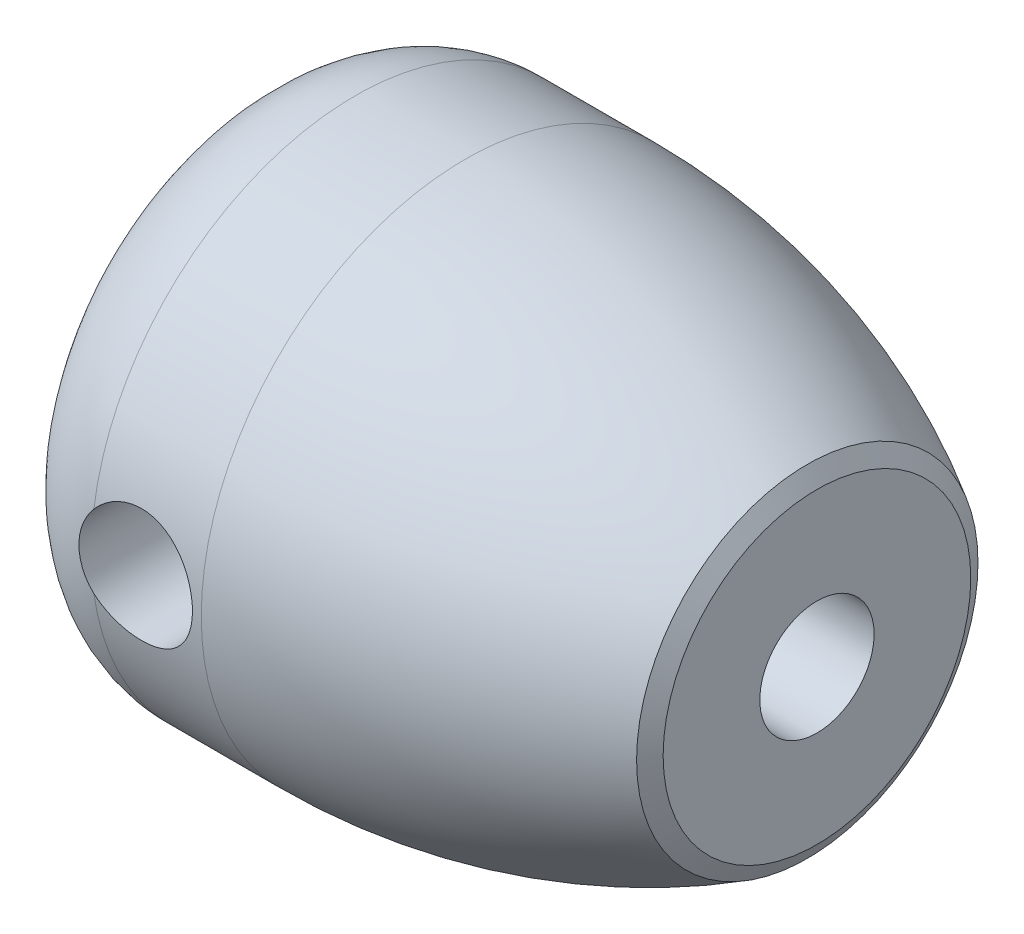
ISO-10303-21;
HEADER;
FILE_DESCRIPTION(('STEP AP214'),'2;1');
FILE_NAME('part.step','',(''),(''),'','','');
FILE_SCHEMA(('AUTOMOTIVE_DESIGN { 1 0 10303 214 1 1 1 1 }'));
ENDSEC;
DATA;
#1=APPLICATION_CONTEXT('core data for automotive mechanical design processes');
#2=APPLICATION_PROTOCOL_DEFINITION('international standard','automotive_design',2000,#1);
#3=PRODUCT_CONTEXT('',#1,'mechanical');
#4=PRODUCT('Part','Part','',(#3));
#5=PRODUCT_RELATED_PRODUCT_CATEGORY('part','',(#4));
#6=PRODUCT_DEFINITION_FORMATION('','',#4);
#7=PRODUCT_DEFINITION_CONTEXT('part definition',#1,'design');
#8=PRODUCT_DEFINITION('design','',#6,#7);
#9=PRODUCT_DEFINITION_SHAPE('','',#8);
#10=(LENGTH_UNIT() NAMED_UNIT(*) SI_UNIT(.MILLI.,.METRE.));
#11=(NAMED_UNIT(*) PLANE_ANGLE_UNIT() SI_UNIT($,.RADIAN.));
#12=(NAMED_UNIT(*) SI_UNIT($,.STERADIAN.) SOLID_ANGLE_UNIT());
#13=UNCERTAINTY_MEASURE_WITH_UNIT(LENGTH_MEASURE(1.E-05),#10,'distance_accuracy_value','');
#14=(GEOMETRIC_REPRESENTATION_CONTEXT(3) GLOBAL_UNCERTAINTY_ASSIGNED_CONTEXT((#13)) GLOBAL_UNIT_ASSIGNED_CONTEXT((#10,
#11,#12)) REPRESENTATION_CONTEXT('',''));
#15=CARTESIAN_POINT('',(0.,0.,0.));
#16=DIRECTION('',(0.,0.,1.));
#17=DIRECTION('',(1.,0.,0.));
#18=AXIS2_PLACEMENT_3D('',#15,#16,#17);
#19=CARTESIAN_POINT('',(150.000000000091,0.,25.7));
#20=DIRECTION('',(-1.,0.,0.));
#21=DIRECTION('',(0.,0.,1.));
#22=AXIS2_PLACEMENT_3D('',#19,#20,#21);
#23=CONICAL_SURFACE('',#22,3.59999999986421,0.785398163397448);
#24=CARTESIAN_POINT('',(149.999999999977,0.,25.7));
#25=DIRECTION('',(-1.,0.,0.));
#26=DIRECTION('',(0.,0.,1.));
#27=AXIS2_PLACEMENT_3D('',#24,#25,#26);
#28=CIRCLE('',#27,3.5999999999779);
#29=CARTESIAN_POINT('',(149.999999999977,0.,22.1000000000221));
#30=VERTEX_POINT('',#29);
#31=EDGE_CURVE('E28',#30,#30,#28,.T.);
#32=ORIENTED_EDGE('',*,*,#31,.T.);
#33=EDGE_LOOP('',(#32));
#34=FACE_BOUND('',#33,.T.);
#35=CARTESIAN_POINT('',(151.,0.,25.7));
#36=DIRECTION('',(-1.,0.,0.));
#37=DIRECTION('',(0.,0.,1.));
#38=AXIS2_PLACEMENT_3D('',#35,#36,#37);
#39=CIRCLE('',#38,2.6);
#40=CARTESIAN_POINT('',(151.000000000005,0.,23.1000000000277));
#41=VERTEX_POINT('',#40);
#42=EDGE_CURVE('E44',#41,#41,#39,.F.);
#43=ORIENTED_EDGE('',*,*,#42,.T.);
#44=EDGE_LOOP('',(#43));
#45=FACE_BOUND('',#44,.T.);
#46=ADVANCED_FACE('F24',(#34,#45),#23,.F.);
#47=CARTESIAN_POINT('',(150.,2.,25.7));
#48=DIRECTION('',(1.,0.,0.));
#49=DIRECTION('',(0.,0.,-1.));
#50=AXIS2_PLACEMENT_3D('',#47,#48,#49);
#51=PLANE('',#50);
#52=CARTESIAN_POINT('',(150.,0.,25.7));
#53=DIRECTION('',(1.,0.,0.));
#54=DIRECTION('',(0.,0.,-1.));
#55=AXIS2_PLACEMENT_3D('',#52,#53,#54);
#56=CIRCLE('',#55,4.);
#57=CARTESIAN_POINT('',(150.,0.,29.7));
#58=VERTEX_POINT('',#57);
#59=EDGE_CURVE('E76',#58,#58,#56,.F.);
#60=ORIENTED_EDGE('',*,*,#59,.T.);
#61=EDGE_LOOP('',(#60));
#62=FACE_BOUND('',#61,.T.);
#63=ORIENTED_EDGE('',*,*,#31,.F.);
#64=EDGE_LOOP('',(#63));
#65=FACE_BOUND('',#64,.T.);
#66=ADVANCED_FACE('F181',(#62,#65),#51,.F.);
#67=CARTESIAN_POINT('',(141.,0.,25.7));
#68=DIRECTION('',(-1.,0.,0.));
#69=DIRECTION('',(0.,0.,1.));
#70=AXIS2_PLACEMENT_3D('',#67,#68,#69);
#71=CYLINDRICAL_SURFACE('',#70,2.6);
#72=CARTESIAN_POINT('',(166.,0.,25.7));
#73=DIRECTION('',(-1.,0.,0.));
#74=DIRECTION('',(0.,0.,1.));
#75=AXIS2_PLACEMENT_3D('',#72,#73,#74);
#76=CIRCLE('',#75,2.6);
#77=CARTESIAN_POINT('',(166.,0.,23.1));
#78=VERTEX_POINT('',#77);
#79=EDGE_CURVE('E75',#78,#78,#76,.T.);
#80=ORIENTED_EDGE('',*,*,#79,.F.);
#81=EDGE_LOOP('',(#80));
#82=FACE_BOUND('',#81,.T.);
#83=ORIENTED_EDGE('',*,*,#42,.F.);
#84=EDGE_LOOP('',(#83));
#85=FACE_BOUND('',#84,.T.);
#86=ADVANCED_FACE('F176',(#82,#85),#71,.F.);
#87=CARTESIAN_POINT('',(158.,0.,25.7));
#88=DIRECTION('',(1.,0.,0.));
#89=DIRECTION('',(0.,0.,-1.));
#90=AXIS2_PLACEMENT_3D('',#87,#88,#89);
#91=CYLINDRICAL_SURFACE('',#90,4.);
#92=CARTESIAN_POINT('',(149.59662296296,0.132475464458119,29.6978057873731));
#93=CARTESIAN_POINT('',(149.58981293636,0.265790039976544,29.6933801911664));
#94=CARTESIAN_POINT('',(149.572677591586,0.398563930924519,29.6822397836795));
#95=CARTESIAN_POINT('',(149.518737574945,0.658551022762243,29.6476094242159));
#96=CARTESIAN_POINT('',(149.481881553717,0.785748764527289,29.624087234746));
#97=CARTESIAN_POINT('',(149.390676512943,1.03034002410986,29.5670501693243));
#98=CARTESIAN_POINT('',(149.336433446386,1.14778763495607,29.5335959061961));
#99=CARTESIAN_POINT('',(149.212523277691,1.37153622468492,29.4593618361864));
#100=CARTESIAN_POINT('',(149.142861440015,1.47784098988018,29.4185845305202));
#101=CARTESIAN_POINT('',(148.982559508075,1.68776328604901,29.3284596396862));
#102=CARTESIAN_POINT('',(148.890545471477,1.79013693831058,29.278664915614));
#103=CARTESIAN_POINT('',(148.691811911872,1.97904276960375,29.1777707577542));
#104=CARTESIAN_POINT('',(148.585066371127,2.06554627594957,29.1266691488874));
#105=CARTESIAN_POINT('',(148.343472919102,2.2314271905501,29.0213790086508));
#106=CARTESIAN_POINT('',(148.206775919937,2.30843234831411,28.9676472730087));
#107=CARTESIAN_POINT('',(147.918248891142,2.43754178054874,28.8725180370249));
#108=CARTESIAN_POINT('',(147.766463564659,2.48971710965312,28.8310854701805));
#109=CARTESIAN_POINT('',(147.499915707366,2.55396335102825,28.7787057802729));
#110=CARTESIAN_POINT('',(147.388001091221,2.57341547561538,28.7623129893019));
#111=CARTESIAN_POINT('',(147.161529954878,2.59746604719984,28.7419465256005));
#112=CARTESIAN_POINT('',(147.046976962762,2.60208328831588,28.737957139367));
#113=CARTESIAN_POINT('',(146.818534308042,2.5961772656909,28.7430039038321));
#114=CARTESIAN_POINT('',(146.70464486658,2.58564921520467,28.7520441726199));
#115=CARTESIAN_POINT('',(146.48065371036,2.55013326471023,28.7817750508417));
#116=CARTESIAN_POINT('',(146.370557333014,2.52512580524618,28.8024814183606));
#117=CARTESIAN_POINT('',(146.128320678821,2.45357824827613,28.8595158953777));
#118=CARTESIAN_POINT('',(145.997981907154,2.4031086040407,28.8985181398427));
#119=CARTESIAN_POINT('',(145.74920277249,2.28355580657512,28.9849359294465));
#120=CARTESIAN_POINT('',(145.630778485635,2.21444795541399,29.0323626093316));
#121=CARTESIAN_POINT('',(145.405264602871,2.05813480704452,29.1311452419162));
#122=CARTESIAN_POINT('',(145.298384220029,1.97066022986807,29.1825515279603));
#123=CARTESIAN_POINT('',(145.099423183974,1.7795675647161,29.2839745988868));
#124=CARTESIAN_POINT('',(145.007345401601,1.67594635289231,29.3339911126824));
#125=CARTESIAN_POINT('',(144.829443013665,1.43981105683484,29.4343368205253));
#126=CARTESIAN_POINT('',(144.745784363972,1.30531039278171,29.4839462100188));
#127=CARTESIAN_POINT('',(144.638905447606,1.09160517561115,29.5488940588772));
#128=CARTESIAN_POINT('',(144.606374329514,1.01835615629513,29.5689698126548));
#129=CARTESIAN_POINT('',(144.54798190071,0.868370235617365,29.6053638276849));
#130=CARTESIAN_POINT('',(144.522115637272,0.791635974347503,29.6216848781264));
#131=CARTESIAN_POINT('',(144.480258737996,0.644970064155253,29.6482742641426));
#132=CARTESIAN_POINT('',(144.463444860924,0.575362159020335,29.6590400869034));
#133=CARTESIAN_POINT('',(144.435573398483,0.43458105014889,29.6769547920284));
#134=CARTESIAN_POINT('',(144.424512405503,0.363408799123864,29.6841058154784));
#135=CARTESIAN_POINT('',(144.408335526373,0.220148835378806,29.694582077932));
#136=CARTESIAN_POINT('',(144.403216134084,0.148061687956418,29.6979095731875));
#137=CARTESIAN_POINT('',(144.398997800455,0.00366179681831511,29.7006515462698));
#138=CARTESIAN_POINT('',(144.399898225894,-0.0686509223698688,29.7000664356606));
#139=CARTESIAN_POINT('',(144.410575339027,-0.265317407721266,29.6931284062543));
#140=CARTESIAN_POINT('',(144.426330268683,-0.389277923129446,29.6828908238801));
#141=CARTESIAN_POINT('',(144.474998982236,-0.632268258703111,29.6516188276201));
#142=CARTESIAN_POINT('',(144.507914670691,-0.751297529999426,29.6305832153366));
#143=CARTESIAN_POINT('',(144.590006336953,-0.983529573800794,29.5790504633626));
#144=CARTESIAN_POINT('',(144.639423979838,-1.09661497215921,29.5484131466757));
#145=CARTESIAN_POINT('',(144.75256663132,-1.31300107241792,29.4800696992444));
#146=CARTESIAN_POINT('',(144.816294896217,-1.41629953973942,29.4423619599886));
#147=CARTESIAN_POINT('',(144.966006857939,-1.62529431405923,29.3568888643979));
#148=CARTESIAN_POINT('',(145.053841867989,-1.72938872680834,29.3084532658949));
#149=CARTESIAN_POINT('',(145.244140859815,-1.9223325400214,29.2094770425533));
#150=CARTESIAN_POINT('',(145.346629264275,-2.01115593287969,29.1589330052504));
#151=CARTESIAN_POINT('',(145.579865778936,-2.18335461998819,29.0532796458776));
#152=CARTESIAN_POINT('',(145.712561871274,-2.2643151433813,28.9984939320642));
#153=CARTESIAN_POINT('',(145.993374271695,-2.40229728636163,28.8994079028301));
#154=CARTESIAN_POINT('',(146.141453870311,-2.45937433216329,28.855083415608));
#155=CARTESIAN_POINT('',(146.404440992849,-2.53339861257035,28.7957144383401));
#156=CARTESIAN_POINT('',(146.516334378456,-2.557206489805,28.7758948307654));
#157=CARTESIAN_POINT('',(146.74367932852,-2.58987233258082,28.7484483611421));
#158=CARTESIAN_POINT('',(146.859125330018,-2.59875256978836,28.7408033358195));
#159=CARTESIAN_POINT('',(147.090494404359,-2.60100337356224,28.738879068557));
#160=CARTESIAN_POINT('',(147.206417962603,-2.59434580804404,28.7446240700045));
#161=CARTESIAN_POINT('',(147.435132209933,-2.56592680671194,28.7686063762949));
#162=CARTESIAN_POINT('',(147.547918735914,-2.5441462112302,28.7868595275781));
#163=CARTESIAN_POINT('',(147.791119176474,-2.48054943618112,28.838290183277));
#164=CARTESIAN_POINT('',(147.92016511967,-2.43545186522669,28.8738197605727));
#165=CARTESIAN_POINT('',(148.16730887644,-2.32715797297412,28.9540529419244));
#166=CARTESIAN_POINT('',(148.285392445963,-2.26393852884479,28.9987682458365));
#167=CARTESIAN_POINT('',(148.511108168794,-2.12007653610016,29.0930486564981));
#168=CARTESIAN_POINT('',(148.618550727395,-2.03917996414209,29.1426780026842));
#169=CARTESIAN_POINT('',(148.819797851726,-1.8618146609321,29.2417504602976));
#170=CARTESIAN_POINT('',(148.913598008454,-1.76534091655544,29.2911935065092));
#171=CARTESIAN_POINT('',(149.099593041642,-1.54142837973626,29.3934186052471));
#172=CARTESIAN_POINT('',(149.189246586867,-1.41150660233766,29.4455150903888));
#173=CARTESIAN_POINT('',(149.305814566445,-1.20396457637036,29.5152102507605));
#174=CARTESIAN_POINT('',(149.34168997321,-1.13266015114456,29.5370368506149));
#175=CARTESIAN_POINT('',(149.407015832335,-0.986253055113381,29.5772490417905));
#176=CARTESIAN_POINT('',(149.436468799538,-0.911151885245865,29.5956359795825));
#177=CARTESIAN_POINT('',(149.502072319254,-0.717526950876205,29.6369286471038));
#178=CARTESIAN_POINT('',(149.533668151805,-0.596837435636188,29.6571675409292));
#179=CARTESIAN_POINT('',(149.579202000132,-0.351086131691645,29.6864740183355));
#180=CARTESIAN_POINT('',(149.593187365202,-0.226037000238632,29.6955715558834));
#181=CARTESIAN_POINT('',(149.599557788611,-0.0618079768832174,29.6997129935192));
#182=CARTESIAN_POINT('',(149.600189162194,-0.0229344333446308,29.7001229150335));
#183=CARTESIAN_POINT('',(149.599713201889,0.0547998404490963,29.6998136219678));
#184=CARTESIAN_POINT('',(149.598605720413,0.0936605693365428,29.6990943115419));
#185=CARTESIAN_POINT('',(149.59662296296,0.132475464458119,29.6978057873731));
#186=B_SPLINE_CURVE_WITH_KNOTS('',3,(#92,#93,#94,#95,#96,#97,#98,#99,#100,#101,#102,#103,#104,
#105,#106,#107,#108,#109,#110,#111,#112,#113,#114,#115,#116,#117,#118,#119,#120,#121,#122,#123,
#124,#125,#126,#127,#128,#129,#130,#131,#132,#133,#134,#135,#136,#137,#138,#139,#140,#141,#142,
#143,#144,#145,#146,#147,#148,#149,#150,#151,#152,#153,#154,#155,#156,#157,#158,#159,#160,#161,
#162,#163,#164,#165,#166,#167,#168,#169,#170,#171,#172,#173,#174,#175,#176,#177,#178,#179,#180,
#181,#182,#183,#184,#185),.UNSPECIFIED.,.T.,.F.,(4,2,2,2,2,2,2,2,2,2,2,2,2,2,2,2,2,2,2,2,2,2,2,
2,2,2,2,2,2,2,2,2,2,2,2,2,2,2,2,2,2,2,2,2,2,2,4),(0.,0.400518308616243,0.802084611771821,
1.20124894669222,1.60027720379704,2.03771914208581,2.47594378926509,2.97089975899597,
3.46443068453901,3.80725688410091,4.14964859005098,4.49214853439135,4.8351122265237,
5.2681201939958,5.70170479408167,6.14215617417302,6.58269287331238,7.07747302731858,
7.32499795374042,7.57233840770576,7.78926515585522,8.00606326487925,8.22273337621442,
8.43938069654597,8.81356212024898,9.18778508070731,9.56774807694332,9.94779761934844,
10.3797904016547,10.8125117624612,11.3045341810873,11.7954083478197,12.1422636341049,
12.4886009601443,12.8355658361477,13.1829710928534,13.6044375030357,14.0264441007896,
14.4549687095857,14.883631504235,15.3792792837832,15.6271916819363,15.8750068296884,
16.2524428294711,16.6288618343455,16.7454639134283,16.8620758898964),.UNSPECIFIED.);
#187=CARTESIAN_POINT('',(149.596622856313,0.132475439500193,29.6978056803613));
#188=VERTEX_POINT('',#187);
#189=EDGE_CURVE('E79',#188,#188,#186,.T.);
#190=ORIENTED_EDGE('',*,*,#189,.T.);
#191=EDGE_LOOP('',(#190));
#192=FACE_BOUND('',#191,.T.);
#193=CARTESIAN_POINT('',(140.,0.,25.7));
#194=DIRECTION('',(1.,0.,0.));
#195=DIRECTION('',(0.,0.,-1.));
#196=AXIS2_PLACEMENT_3D('',#193,#194,#195);
#197=CIRCLE('',#196,4.);
#198=CARTESIAN_POINT('',(140.,0.,29.7));
#199=VERTEX_POINT('',#198);
#200=EDGE_CURVE('E71',#199,#199,#197,.F.);
#201=ORIENTED_EDGE('',*,*,#200,.T.);
#202=EDGE_LOOP('',(#201));
#203=FACE_BOUND('',#202,.T.);
#204=ORIENTED_EDGE('',*,*,#59,.F.);
#205=EDGE_LOOP('',(#204));
#206=FACE_BOUND('',#205,.T.);
#207=ADVANCED_FACE('F72',(#192,#203,#206),#91,.F.);
#208=CARTESIAN_POINT('',(140.,8.,25.7));
#209=DIRECTION('',(1.,0.,0.));
#210=DIRECTION('',(0.,0.,-1.));
#211=AXIS2_PLACEMENT_3D('',#208,#209,#210);
#212=PLANE('',#211);
#213=ORIENTED_EDGE('',*,*,#200,.F.);
#214=EDGE_LOOP('',(#213));
#215=FACE_BOUND('',#214,.T.);
#216=CARTESIAN_POINT('',(140.,0.,25.7));
#217=DIRECTION('',(1.,0.,0.));
#218=DIRECTION('',(0.,0.,-1.));
#219=AXIS2_PLACEMENT_3D('',#216,#217,#218);
#220=CIRCLE('',#219,7.);
#221=CARTESIAN_POINT('',(140.,0.,18.7));
#222=VERTEX_POINT('',#221);
#223=EDGE_CURVE('E157',#222,#222,#220,.T.);
#224=ORIENTED_EDGE('',*,*,#223,.F.);
#225=EDGE_LOOP('',(#224));
#226=FACE_BOUND('',#225,.T.);
#227=ADVANCED_FACE('F162',(#215,#226),#212,.F.);
#228=CARTESIAN_POINT('',(166.,3.75,25.7));
#229=DIRECTION('',(1.,0.,0.));
#230=DIRECTION('',(0.,0.,-1.));
#231=AXIS2_PLACEMENT_3D('',#228,#229,#230);
#232=PLANE('',#231);
#233=ORIENTED_EDGE('',*,*,#79,.T.);
#234=EDGE_LOOP('',(#233));
#235=FACE_BOUND('',#234,.T.);
#236=CARTESIAN_POINT('',(166.000000016742,0.,25.7));
#237=DIRECTION('',(-1.,0.,0.));
#238=DIRECTION('',(0.,-1.,0.));
#239=AXIS2_PLACEMENT_3D('',#236,#237,#238);
#240=CIRCLE('',#239,6.9951346840793);
#241=CARTESIAN_POINT('',(166.000000016742,0.,18.7048653159207));
#242=VERTEX_POINT('',#241);
#243=EDGE_CURVE('E120',#242,#242,#240,.T.);
#244=ORIENTED_EDGE('',*,*,#243,.F.);
#245=EDGE_LOOP('',(#244));
#246=FACE_BOUND('',#245,.T.);
#247=ADVANCED_FACE('F103',(#235,#246),#232,.T.);
#248=CARTESIAN_POINT('',(147.,0.,50.7));
#249=DIRECTION('',(0.,0.,1.));
#250=DIRECTION('',(1.,0.,0.));
#251=AXIS2_PLACEMENT_3D('',#248,#249,#250);
#252=CYLINDRICAL_SURFACE('',#251,2.6);
#253=ORIENTED_EDGE('',*,*,#189,.F.);
#254=EDGE_LOOP('',(#253));
#255=FACE_BOUND('',#254,.T.);
#256=CARTESIAN_POINT('',(145.,-1.66132477258355,37.5844436133965));
#257=CARTESIAN_POINT('',(144.954030730864,-1.60599821193209,37.5921781853039));
#258=CARTESIAN_POINT('',(144.910322555604,-1.54869417491541,37.5991541323627));
#259=CARTESIAN_POINT('',(144.827751064601,-1.43056471546217,37.6117540189274));
#260=CARTESIAN_POINT('',(144.788887209623,-1.36973968606447,37.6173781089778));
#261=CARTESIAN_POINT('',(144.716350733501,-1.24504788758821,37.6274364464122));
#262=CARTESIAN_POINT('',(144.682673269873,-1.18118402968037,37.6318718066029));
#263=CARTESIAN_POINT('',(144.620727415788,-1.05084528925676,37.6397141802864));
#264=CARTESIAN_POINT('',(144.592459040563,-0.98437039938931,37.6431211908838));
#265=CARTESIAN_POINT('',(144.516098988535,-0.781686126795168,37.6520199938556));
#266=CARTESIAN_POINT('',(144.476406296412,-0.642137810601589,37.6561954947261));
#267=CARTESIAN_POINT('',(144.420767420626,-0.358443976842378,37.6618873127111));
#268=CARTESIAN_POINT('',(144.404816349319,-0.214299411741231,37.6634041771656));
#269=CARTESIAN_POINT('',(144.397039780855,0.0753724908856252,37.6641556180581));
#270=CARTESIAN_POINT('',(144.405332830606,0.220903143147724,37.6633789797265));
#271=CARTESIAN_POINT('',(144.446092490359,0.508602704192278,37.6593205410185));
#272=CARTESIAN_POINT('',(144.478574958229,0.650769344517419,37.6560370972189));
#273=CARTESIAN_POINT('',(144.566822508326,0.927810347237031,37.6462248896265));
#274=CARTESIAN_POINT('',(144.622626394383,1.0626721308642,37.6396907135681));
#275=CARTESIAN_POINT('',(144.755750482228,1.32072881094094,37.6222346106281));
#276=CARTESIAN_POINT('',(144.833020337815,1.44395011357994,37.6113229244662));
#277=CARTESIAN_POINT('',(144.945625743606,1.59419059331891,37.5934565329378));
#278=CARTESIAN_POINT('',(144.972410703206,1.6281239929422,37.5890859071634));
#279=CARTESIAN_POINT('',(145.,1.66132477258359,37.5844436133965));
#280=B_SPLINE_CURVE_WITH_KNOTS('',3,(#256,#257,#258,#259,#260,#261,#262,#263,#264,#265,#266,
#267,#268,#269,#270,#271,#272,#273,#274,#275,#276,#277,#278,#279),.UNSPECIFIED.,.F.,.F.,(4,2,2,
2,2,2,2,2,2,2,2,4),(0.,0.216965041410872,0.433905910129942,0.650642978818805,0.867380657800993,
1.30058366624938,1.73369747963182,2.16893263405376,2.60445336723912,3.04070165412698,
3.47593528087374,3.60622716281149),.UNSPECIFIED.);
#281=CARTESIAN_POINT('',(145.,-1.66132477258357,37.5844436133965));
#282=VERTEX_POINT('',#281);
#283=CARTESIAN_POINT('',(145.,1.66132477258359,37.5844436133965));
#284=VERTEX_POINT('',#283);
#285=EDGE_CURVE('E88',#282,#284,#280,.T.);
#286=ORIENTED_EDGE('',*,*,#285,.F.);
#287=CARTESIAN_POINT('',(145.,1.66132477258359,37.5844436133965));
#288=CARTESIAN_POINT('',(145.046758920054,1.71761333184702,37.576575712641));
#289=CARTESIAN_POINT('',(145.095861372958,1.77189066138255,37.568579820057));
#290=CARTESIAN_POINT('',(145.198459432226,1.87611450652157,37.5525512301044));
#291=CARTESIAN_POINT('',(145.251955021089,1.92606103937577,37.5445185328826));
#292=CARTESIAN_POINT('',(145.418511737267,2.0688744172386,37.5207052663738));
#293=CARTESIAN_POINT('',(145.537710564397,2.15479645968062,37.5051976374271));
#294=CARTESIAN_POINT('',(145.789128007313,2.30549591076681,37.4766977916931));
#295=CARTESIAN_POINT('',(145.921356448896,2.37025720051266,37.4637074954985));
#296=CARTESIAN_POINT('',(146.195093035321,2.47662194801103,37.4417761732574));
#297=CARTESIAN_POINT('',(146.336596132822,2.51823788657988,37.4328329653594));
#298=CARTESIAN_POINT('',(146.622908225687,2.57659994291362,37.4201546337956));
#299=CARTESIAN_POINT('',(146.767648498704,2.59366853744076,37.416352019177));
#300=CARTESIAN_POINT('',(147.058010877983,2.60340807796047,37.4141920353531));
#301=CARTESIAN_POINT('',(147.203633072978,2.59607652683514,37.4158352234727));
#302=CARTESIAN_POINT('',(147.48909375802,2.55757605894157,37.4242984273563));
#303=CARTESIAN_POINT('',(147.62898786765,2.52679846912449,37.4310334439466));
#304=CARTESIAN_POINT('',(147.901581929789,2.44284498842998,37.4488013924747));
#305=CARTESIAN_POINT('',(148.034281912962,2.38966919303486,37.4598343060908));
#306=CARTESIAN_POINT('',(148.290257217354,2.26183808508929,37.4850904139298));
#307=CARTESIAN_POINT('',(148.413423193548,2.18697021081379,37.4993448561967));
#308=CARTESIAN_POINT('',(148.645616517696,2.01805964006745,37.5294029725713));
#309=CARTESIAN_POINT('',(148.75464168545,1.92401399254639,37.5452068849149));
#310=CARTESIAN_POINT('',(148.957806963277,1.71710310263086,37.5769825146988));
#311=CARTESIAN_POINT('',(149.051592411785,1.6038887271572,37.5929509382818));
#312=CARTESIAN_POINT('',(149.218875774468,1.36311337433272,37.6229449830443));
#313=CARTESIAN_POINT('',(149.292373815482,1.23555248668456,37.63697061637));
#314=CARTESIAN_POINT('',(149.416891250827,0.969628354408094,37.661505851345));
#315=CARTESIAN_POINT('',(149.467919772315,0.831269522859373,37.6720168802146));
#316=CARTESIAN_POINT('',(149.5459146112,0.547666580367204,37.6883365235443));
#317=CARTESIAN_POINT('',(149.572884408909,0.402423468499354,37.6941458181415));
#318=CARTESIAN_POINT('',(149.601577951867,0.112307469721345,37.7003339770458));
#319=CARTESIAN_POINT('',(149.603798424762,-0.0325141387324142,37.7008196842869));
#320=CARTESIAN_POINT('',(149.584209350162,-0.320438163324338,37.6965848560531));
#321=CARTESIAN_POINT('',(149.562401062062,-0.463540669166668,37.6918645934333));
#322=CARTESIAN_POINT('',(149.495756586756,-0.742710828603696,37.6778028740567));
#323=CARTESIAN_POINT('',(149.451121395688,-0.878828660085967,37.6685017785845));
#324=CARTESIAN_POINT('',(149.340288499004,-1.14166415652846,37.6462971707045));
#325=CARTESIAN_POINT('',(149.27408878784,-1.26838094582484,37.6333933232489));
#326=CARTESIAN_POINT('',(149.120805294963,-1.51099146148045,37.6051278802127));
#327=CARTESIAN_POINT('',(149.033410802971,-1.62668470163192,37.5897309716683));
#328=CARTESIAN_POINT('',(148.840691411961,-1.84193635426448,37.5582935352577));
#329=CARTESIAN_POINT('',(148.735364285558,-1.94149275941222,37.542252927628));
#330=CARTESIAN_POINT('',(148.507643998417,-2.12334463352459,37.5110153467952));
#331=CARTESIAN_POINT('',(148.384993707676,-2.20532179424405,37.4958370890975));
#332=CARTESIAN_POINT('',(148.127357385679,-2.34748964313372,37.4683711095849));
#333=CARTESIAN_POINT('',(147.992372217935,-2.40768185491277,37.4560831856452));
#334=CARTESIAN_POINT('',(147.714979511402,-2.50403388586196,37.4359377650303));
#335=CARTESIAN_POINT('',(147.572640388137,-2.54038306821519,37.4280454358523));
#336=CARTESIAN_POINT('',(147.283692697446,-2.58862206423095,37.4174937228608));
#337=CARTESIAN_POINT('',(147.137084752143,-2.60051542408336,37.4148335803622));
#338=CARTESIAN_POINT('',(146.847077012616,-2.59946135689947,37.415067011203));
#339=CARTESIAN_POINT('',(146.703674928297,-2.5870338399906,37.4178443474544));
#340=CARTESIAN_POINT('',(146.421049460536,-2.53877269208914,37.4283943148861));
#341=CARTESIAN_POINT('',(146.281826338136,-2.50293760209443,37.4361672574439));
#342=CARTESIAN_POINT('',(146.011527795464,-2.40902329750234,37.4558024373356));
#343=CARTESIAN_POINT('',(145.880447581762,-2.35095731643064,37.4676622414383));
#344=CARTESIAN_POINT('',(145.629818933063,-2.21426197591887,37.4941452620945));
#345=CARTESIAN_POINT('',(145.510266124223,-2.1356404582282,37.5087674242448));
#346=CARTESIAN_POINT('',(145.324982175463,-1.99071341695434,37.5338673368854));
#347=CARTESIAN_POINT('',(145.255019143047,-1.92967172803918,37.5440124955988));
#348=CARTESIAN_POINT('',(145.12211948063,-1.80059306920436,37.5643219991983));
#349=CARTESIAN_POINT('',(145.059170759062,-1.73256853819777,37.5744862793615));
#350=CARTESIAN_POINT('',(145.,-1.66132477258356,37.5844436133965));
#351=B_SPLINE_CURVE_WITH_KNOTS('',3,(#287,#288,#289,#290,#291,#292,#293,#294,#295,#296,#297,
#298,#299,#300,#301,#302,#303,#304,#305,#306,#307,#308,#309,#310,#311,#312,#313,#314,#315,#316,
#317,#318,#319,#320,#321,#322,#323,#324,#325,#326,#327,#328,#329,#330,#331,#332,#333,#334,#335,
#336,#337,#338,#339,#340,#341,#342,#343,#344,#345,#346,#347,#348,#349,#350),.UNSPECIFIED.,.F.,
.F.,(4,2,2,2,2,2,2,2,2,2,2,2,2,2,2,2,2,2,2,2,2,2,2,2,2,2,2,2,2,2,2,4),(0.,0.220659199010681,
0.44131751903702,0.882318426537613,1.32365448121447,1.76475232010284,2.20000082731226,
2.6352938793481,3.06347664917965,3.49165759371018,3.92418505609724,4.35677912552675,
4.7983239822531,5.23986607833993,5.68122865343398,6.12252737109406,6.55495273237251,
6.987355430468,7.41601464802716,7.84471374322195,8.28012399319936,8.71558836431371,
9.15837330666668,9.60112727527368,10.0403208556802,10.4794507468081,10.9092957895718,
11.3391676272826,11.768783969289,12.1982366551268,12.4779523359015,12.7571781172584),.UNSPECIFIED.);
#352=EDGE_CURVE('E111',#284,#282,#351,.T.);
#353=ORIENTED_EDGE('',*,*,#352,.F.);
#354=EDGE_LOOP('',(#286,#353));
#355=FACE_BOUND('',#354,.T.);
#356=ADVANCED_FACE('F98',(#255,#355),#252,.F.);
#357=CARTESIAN_POINT('',(145.,0.,25.7));
#358=DIRECTION('',(1.,0.,0.));
#359=DIRECTION('',(0.,0.,-1.));
#360=AXIS2_PLACEMENT_3D('',#357,#358,#359);
#361=TOROIDAL_SURFACE('',#360,7.,5.);
#362=ORIENTED_EDGE('',*,*,#223,.T.);
#363=EDGE_LOOP('',(#362));
#364=FACE_BOUND('',#363,.T.);
#365=ORIENTED_EDGE('',*,*,#285,.T.);
#366=CARTESIAN_POINT('',(145.,0.,25.7));
#367=DIRECTION('',(1.,0.,0.));
#368=DIRECTION('',(0.,0.,-1.));
#369=AXIS2_PLACEMENT_3D('',#366,#367,#368);
#370=CIRCLE('',#369,12.);
#371=EDGE_CURVE('E119',#282,#284,#370,.T.);
#372=ORIENTED_EDGE('',*,*,#371,.F.);
#373=EDGE_LOOP('',(#365,#372));
#374=FACE_BOUND('',#373,.T.);
#375=ADVANCED_FACE('F102',(#364,#374),#361,.T.);
#376=CARTESIAN_POINT('',(165.560542222052,0.,25.7));
#377=DIRECTION('',(-1.,0.,0.));
#378=DIRECTION('',(0.,-1.,0.));
#379=AXIS2_PLACEMENT_3D('',#376,#377,#378);
#380=CONICAL_SURFACE('',#379,7.76341727069954,1.05121939720001);
#381=CARTESIAN_POINT('',(165.560542205292,0.,25.7));
#382=DIRECTION('',(-1.,0.,0.));
#383=DIRECTION('',(0.,0.,1.));
#384=AXIS2_PLACEMENT_3D('',#381,#382,#383);
#385=CIRCLE('',#384,7.7634172611129);
#386=CARTESIAN_POINT('',(165.560542213672,0.,33.4634172659062));
#387=VERTEX_POINT('',#386);
#388=EDGE_CURVE('E33',#387,#387,#385,.T.);
#389=ORIENTED_EDGE('',*,*,#388,.F.);
#390=EDGE_LOOP('',(#389));
#391=FACE_BOUND('',#390,.T.);
#392=ORIENTED_EDGE('',*,*,#243,.T.);
#393=EDGE_LOOP('',(#392));
#394=FACE_BOUND('',#393,.T.);
#395=ADVANCED_FACE('F126',(#391,#394),#380,.T.);
#396=CARTESIAN_POINT('',(158.,0.,25.7));
#397=DIRECTION('',(1.,0.,0.));
#398=DIRECTION('',(0.,0.,-1.));
#399=AXIS2_PLACEMENT_3D('',#396,#397,#398);
#400=CYLINDRICAL_SURFACE('',#399,12.);
#401=ORIENTED_EDGE('',*,*,#352,.T.);
#402=ORIENTED_EDGE('',*,*,#371,.T.);
#403=EDGE_LOOP('',(#401,#402));
#404=FACE_BOUND('',#403,.T.);
#405=CARTESIAN_POINT('',(150.,0.,25.7));
#406=DIRECTION('',(1.,0.,0.));
#407=DIRECTION('',(0.,0.,1.));
#408=AXIS2_PLACEMENT_3D('',#405,#406,#407);
#409=CIRCLE('',#408,12.0000000000001);
#410=CARTESIAN_POINT('',(150.,0.,37.7000000000001));
#411=VERTEX_POINT('',#410);
#412=EDGE_CURVE('E13',#411,#411,#409,.T.);
#413=ORIENTED_EDGE('',*,*,#412,.F.);
#414=EDGE_LOOP('',(#413));
#415=FACE_BOUND('',#414,.T.);
#416=ADVANCED_FACE('F123',(#404,#415),#400,.T.);
#417=CARTESIAN_POINT('',(150.,0.,25.7));
#418=DIRECTION('',(-1.,0.,0.));
#419=DIRECTION('',(0.,0.,1.));
#420=AXIS2_PLACEMENT_3D('',#417,#418,#419);
#421=DEGENERATE_TOROIDAL_SURFACE('',#420,18.6944444444393,30.6944444444396,.F.);
#422=ORIENTED_EDGE('',*,*,#412,.T.);
#423=EDGE_LOOP('',(#422));
#424=FACE_BOUND('',#423,.T.);
#425=ORIENTED_EDGE('',*,*,#388,.T.);
#426=EDGE_LOOP('',(#425));
#427=FACE_BOUND('',#426,.T.);
#428=ADVANCED_FACE('F26',(#424,#427),#421,.F.);
#429=CLOSED_SHELL('',(#46,#66,#86,#207,#227,#247,#356,#375,#395,#416,#428));
#430=MANIFOLD_SOLID_BREP('B1',#429);
#431=ADVANCED_BREP_SHAPE_REPRESENTATION('',(#18,#430),#14);
#432=SHAPE_DEFINITION_REPRESENTATION(#9,#431);
ENDSEC;
END-ISO-10303-21;
